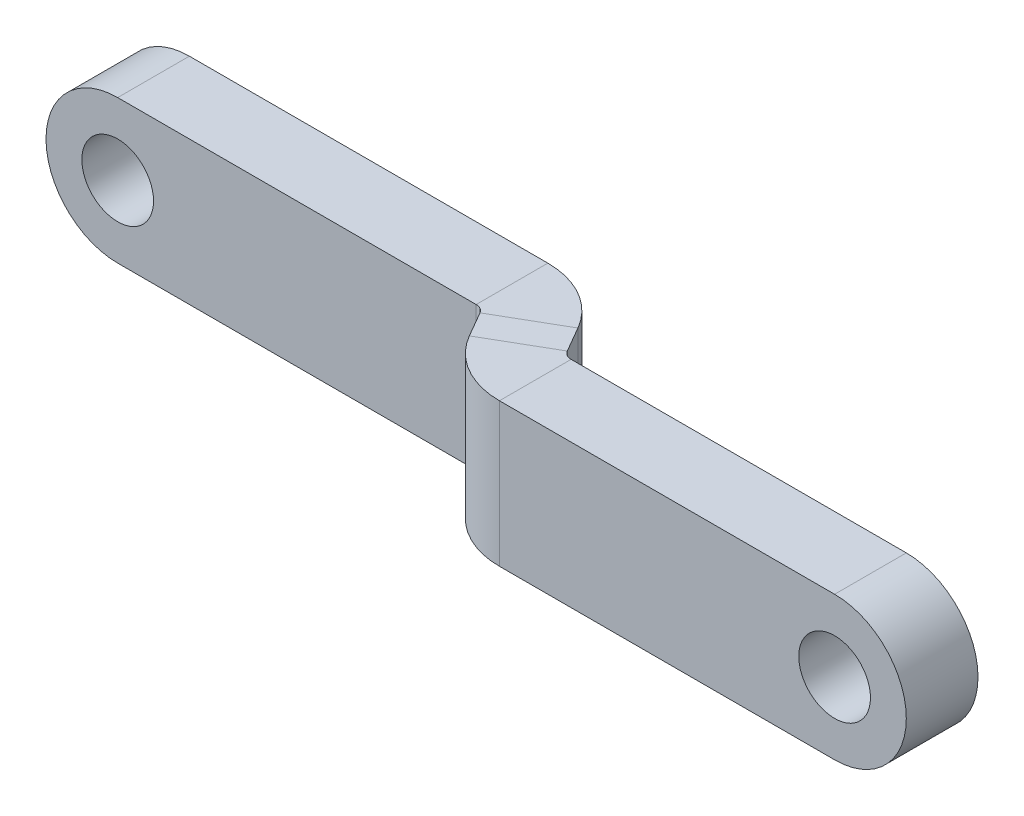
ISO-10303-21;
HEADER;
FILE_DESCRIPTION(('STEP AP214'),'2;1');
FILE_NAME('part.step','',(''),(''),'','','');
FILE_SCHEMA(('AUTOMOTIVE_DESIGN { 1 0 10303 214 1 1 1 1 }'));
ENDSEC;
DATA;
#1=APPLICATION_CONTEXT('core data for automotive mechanical design processes');
#2=APPLICATION_PROTOCOL_DEFINITION('international standard','automotive_design',2000,#1);
#3=PRODUCT_CONTEXT('',#1,'mechanical');
#4=PRODUCT('Part','Part','',(#3));
#5=PRODUCT_RELATED_PRODUCT_CATEGORY('part','',(#4));
#6=PRODUCT_DEFINITION_FORMATION('','',#4);
#7=PRODUCT_DEFINITION_CONTEXT('part definition',#1,'design');
#8=PRODUCT_DEFINITION('design','',#6,#7);
#9=PRODUCT_DEFINITION_SHAPE('','',#8);
#10=(LENGTH_UNIT() NAMED_UNIT(*) SI_UNIT(.MILLI.,.METRE.));
#11=(NAMED_UNIT(*) PLANE_ANGLE_UNIT() SI_UNIT($,.RADIAN.));
#12=(NAMED_UNIT(*) SI_UNIT($,.STERADIAN.) SOLID_ANGLE_UNIT());
#13=UNCERTAINTY_MEASURE_WITH_UNIT(LENGTH_MEASURE(1.E-05),#10,'distance_accuracy_value','');
#14=(GEOMETRIC_REPRESENTATION_CONTEXT(3) GLOBAL_UNCERTAINTY_ASSIGNED_CONTEXT((#13)) GLOBAL_UNIT_ASSIGNED_CONTEXT((#10,
#11,#12)) REPRESENTATION_CONTEXT('',''));
#15=CARTESIAN_POINT('',(0.,0.,0.));
#16=DIRECTION('',(0.,0.,1.));
#17=DIRECTION('',(1.,0.,0.));
#18=AXIS2_PLACEMENT_3D('',#15,#16,#17);
#19=CARTESIAN_POINT('',(15.7733615342484,5.,-26.7176066057512));
#20=DIRECTION('',(0.,1.,0.));
#21=DIRECTION('',(-0.86602540378444,0.,0.499999999999998));
#22=AXIS2_PLACEMENT_3D('',#19,#20,#21);
#23=PLANE('',#22);
#24=DIRECTION('',(-0.499999999999998,0.,-0.86602540378444));
#25=VECTOR('',#24,1.);
#26=CARTESIAN_POINT('',(11.4432345153262,5.,-24.2176066057512));
#27=LINE('',#26,#25);
#28=CARTESIAN_POINT('',(26.6560137771166,5.,2.13170000000001));
#29=VERTEX_POINT('',#28);
#30=CARTESIAN_POINT('',(25.6379143124276,5.,0.368300000000002));
#31=VERTEX_POINT('',#30);
#32=EDGE_CURVE('E250',#29,#31,#27,.T.);
#33=ORIENTED_EDGE('',*,*,#32,.F.);
#34=DIRECTION('',(0.86602540378444,0.,-0.499999999999998));
#35=VECTOR('',#34,1.);
#36=CARTESIAN_POINT('',(30.9861407960388,5.,-0.368299999999985));
#37=LINE('',#36,#35);
#38=CARTESIAN_POINT('',(30.9861407960388,5.,-0.368299999999983));
#39=VERTEX_POINT('',#38);
#40=EDGE_CURVE('E242',#29,#39,#37,.T.);
#41=ORIENTED_EDGE('',*,*,#40,.T.);
#42=DIRECTION('',(-0.499999999999998,0.,-0.86602540378444));
#43=VECTOR('',#42,1.);
#44=CARTESIAN_POINT('',(15.7733615342484,5.,-26.7176066057512));
#45=LINE('',#44,#43);
#46=CARTESIAN_POINT('',(29.9680413313498,5.,-2.13169999999999));
#47=VERTEX_POINT('',#46);
#48=EDGE_CURVE('E49',#39,#47,#45,.T.);
#49=ORIENTED_EDGE('',*,*,#48,.T.);
#50=DIRECTION('',(0.86602540378444,0.,-0.499999999999998));
#51=VECTOR('',#50,1.);
#52=CARTESIAN_POINT('',(29.9680413313498,5.,-2.13169999999999));
#53=LINE('',#52,#51);
#54=EDGE_CURVE('E238',#31,#47,#53,.T.);
#55=ORIENTED_EDGE('',*,*,#54,.F.);
#56=EDGE_LOOP('',(#33,#41,#49,#55));
#57=FACE_BOUND('',#56,.T.);
#58=ADVANCED_FACE('F45',(#57),#23,.T.);
#59=CARTESIAN_POINT('',(15.7733615342484,-5.,-26.7176066057512));
#60=DIRECTION('',(0.,-1.,0.));
#61=DIRECTION('',(0.86602540378444,0.,-0.499999999999998));
#62=AXIS2_PLACEMENT_3D('',#59,#60,#61);
#63=PLANE('',#62);
#64=DIRECTION('',(0.499999999999998,0.,0.86602540378444));
#65=VECTOR('',#64,1.);
#66=CARTESIAN_POINT('',(15.7733615342484,-5.,-26.7176066057512));
#67=LINE('',#66,#65);
#68=CARTESIAN_POINT('',(29.9680413313498,-5.,-2.13169999999999));
#69=VERTEX_POINT('',#68);
#70=CARTESIAN_POINT('',(30.9861407960388,-5.,-0.368299999999984));
#71=VERTEX_POINT('',#70);
#72=EDGE_CURVE('E247',#69,#71,#67,.T.);
#73=ORIENTED_EDGE('',*,*,#72,.T.);
#74=DIRECTION('',(-0.86602540378444,0.,0.499999999999998));
#75=VECTOR('',#74,1.);
#76=CARTESIAN_POINT('',(30.9861407960388,-5.,-0.368299999999985));
#77=LINE('',#76,#75);
#78=CARTESIAN_POINT('',(26.6560137771166,-5.,2.13170000000001));
#79=VERTEX_POINT('',#78);
#80=EDGE_CURVE('E12',#71,#79,#77,.T.);
#81=ORIENTED_EDGE('',*,*,#80,.T.);
#82=DIRECTION('',(0.499999999999998,0.,0.86602540378444));
#83=VECTOR('',#82,1.);
#84=CARTESIAN_POINT('',(11.4432345153262,-5.,-24.2176066057512));
#85=LINE('',#84,#83);
#86=CARTESIAN_POINT('',(25.6379143124276,-5.,0.368300000000002));
#87=VERTEX_POINT('',#86);
#88=EDGE_CURVE('E196',#87,#79,#85,.T.);
#89=ORIENTED_EDGE('',*,*,#88,.F.);
#90=DIRECTION('',(-0.86602540378444,0.,0.499999999999998));
#91=VECTOR('',#90,1.);
#92=CARTESIAN_POINT('',(29.9680413313498,-5.,-2.13169999999999));
#93=LINE('',#92,#91);
#94=EDGE_CURVE('E234',#69,#87,#93,.T.);
#95=ORIENTED_EDGE('',*,*,#94,.F.);
#96=EDGE_LOOP('',(#73,#81,#89,#95));
#97=FACE_BOUND('',#96,.T.);
#98=ADVANCED_FACE('F47',(#97),#63,.T.);
#99=CARTESIAN_POINT('',(11.4432345153262,0.,-24.2176066057512));
#100=DIRECTION('',(-0.86602540378444,0.,0.499999999999998));
#101=DIRECTION('',(0.499999999999998,0.,0.86602540378444));
#102=AXIS2_PLACEMENT_3D('',#99,#100,#101);
#103=PLANE('',#102);
#104=ORIENTED_EDGE('',*,*,#88,.T.);
#105=DIRECTION('',(0.,1.,0.));
#106=VECTOR('',#105,1.);
#107=CARTESIAN_POINT('',(26.6560137771166,0.,2.13170000000001));
#108=LINE('',#107,#106);
#109=EDGE_CURVE('E54',#79,#29,#108,.T.);
#110=ORIENTED_EDGE('',*,*,#109,.T.);
#111=ORIENTED_EDGE('',*,*,#32,.T.);
#112=DIRECTION('',(0.,1.,0.));
#113=VECTOR('',#112,1.);
#114=CARTESIAN_POINT('',(25.6379143124276,0.,0.368300000000002));
#115=LINE('',#114,#113);
#116=EDGE_CURVE('E236',#87,#31,#115,.T.);
#117=ORIENTED_EDGE('',*,*,#116,.F.);
#118=EDGE_LOOP('',(#104,#110,#111,#117));
#119=FACE_BOUND('',#118,.T.);
#120=ADVANCED_FACE('F256',(#119),#103,.T.);
#121=CARTESIAN_POINT('',(15.7733615342484,0.,-26.7176066057512));
#122=DIRECTION('',(-0.86602540378444,0.,0.499999999999998));
#123=DIRECTION('',(0.499999999999998,0.,0.86602540378444));
#124=AXIS2_PLACEMENT_3D('',#121,#122,#123);
#125=PLANE('',#124);
#126=DIRECTION('',(0.,1.,0.));
#127=VECTOR('',#126,1.);
#128=CARTESIAN_POINT('',(30.9861407960388,0.,-0.368299999999985));
#129=LINE('',#128,#127);
#130=EDGE_CURVE('E240',#71,#39,#129,.T.);
#131=ORIENTED_EDGE('',*,*,#130,.F.);
#132=ORIENTED_EDGE('',*,*,#72,.F.);
#133=DIRECTION('',(0.,1.,0.));
#134=VECTOR('',#133,1.);
#135=CARTESIAN_POINT('',(29.9680413313498,0.,-2.13169999999999));
#136=LINE('',#135,#134);
#137=EDGE_CURVE('E231',#69,#47,#136,.T.);
#138=ORIENTED_EDGE('',*,*,#137,.T.);
#139=ORIENTED_EDGE('',*,*,#48,.F.);
#140=EDGE_LOOP('',(#131,#132,#138,#139));
#141=FACE_BOUND('',#140,.T.);
#142=ADVANCED_FACE('F269',(#141),#125,.F.);
#143=CARTESIAN_POINT('',(0.,0.,-5.));
#144=DIRECTION('',(0.,0.,1.));
#145=DIRECTION('',(1.,0.,0.));
#146=AXIS2_PLACEMENT_3D('',#143,#144,#145);
#147=CYLINDRICAL_SURFACE('',#146,2.5);
#148=CARTESIAN_POINT('',(0.,0.,-5.));
#149=DIRECTION('',(0.,0.,1.));
#150=DIRECTION('',(1.,0.,0.));
#151=AXIS2_PLACEMENT_3D('',#148,#149,#150);
#152=CIRCLE('',#151,2.5);
#153=CARTESIAN_POINT('',(2.5,0.,-5.));
#154=VERTEX_POINT('',#153);
#155=EDGE_CURVE('E219',#154,#154,#152,.T.);
#156=ORIENTED_EDGE('',*,*,#155,.F.);
#157=EDGE_LOOP('',(#156));
#158=FACE_BOUND('',#157,.T.);
#159=CARTESIAN_POINT('',(0.,0.,0.));
#160=DIRECTION('',(0.,0.,1.));
#161=DIRECTION('',(1.,0.,0.));
#162=AXIS2_PLACEMENT_3D('',#159,#160,#161);
#163=CIRCLE('',#162,2.5);
#164=CARTESIAN_POINT('',(2.5,0.,0.));
#165=VERTEX_POINT('',#164);
#166=EDGE_CURVE('E227',#165,#165,#163,.T.);
#167=ORIENTED_EDGE('',*,*,#166,.T.);
#168=EDGE_LOOP('',(#167));
#169=FACE_BOUND('',#168,.T.);
#170=ADVANCED_FACE('F318',(#158,#169),#147,.F.);
#171=CARTESIAN_POINT('',(0.,0.,-5.));
#172=DIRECTION('',(0.,0.,1.));
#173=DIRECTION('',(1.,0.,0.));
#174=AXIS2_PLACEMENT_3D('',#171,#172,#173);
#175=CYLINDRICAL_SURFACE('',#174,5.);
#176=CARTESIAN_POINT('',(0.,0.,0.));
#177=DIRECTION('',(0.,0.,1.));
#178=DIRECTION('',(1.,0.,0.));
#179=AXIS2_PLACEMENT_3D('',#176,#177,#178);
#180=CIRCLE('',#179,5.);
#181=CARTESIAN_POINT('',(0.,5.,0.));
#182=VERTEX_POINT('',#181);
#183=CARTESIAN_POINT('',(0.,-5.,0.));
#184=VERTEX_POINT('',#183);
#185=EDGE_CURVE('E202',#182,#184,#180,.T.);
#186=ORIENTED_EDGE('',*,*,#185,.F.);
#187=DIRECTION('',(0.,0.,1.));
#188=VECTOR('',#187,1.);
#189=CARTESIAN_POINT('',(0.,5.,-5.));
#190=LINE('',#189,#188);
#191=CARTESIAN_POINT('',(0.,5.,-5.));
#192=VERTEX_POINT('',#191);
#193=EDGE_CURVE('E193',#192,#182,#190,.T.);
#194=ORIENTED_EDGE('',*,*,#193,.F.);
#195=CARTESIAN_POINT('',(0.,0.,-5.));
#196=DIRECTION('',(0.,0.,1.));
#197=DIRECTION('',(1.,0.,0.));
#198=AXIS2_PLACEMENT_3D('',#195,#196,#197);
#199=CIRCLE('',#198,5.);
#200=CARTESIAN_POINT('',(0.,-5.,-5.));
#201=VERTEX_POINT('',#200);
#202=EDGE_CURVE('E224',#192,#201,#199,.T.);
#203=ORIENTED_EDGE('',*,*,#202,.T.);
#204=DIRECTION('',(0.,0.,1.));
#205=VECTOR('',#204,1.);
#206=CARTESIAN_POINT('',(0.,-5.,-5.));
#207=LINE('',#206,#205);
#208=EDGE_CURVE('E222',#201,#184,#207,.T.);
#209=ORIENTED_EDGE('',*,*,#208,.T.);
#210=EDGE_LOOP('',(#186,#194,#203,#209));
#211=FACE_BOUND('',#210,.T.);
#212=ADVANCED_FACE('F322',(#211),#175,.T.);
#213=CARTESIAN_POINT('',(0.,0.,-5.));
#214=DIRECTION('',(0.,0.,1.));
#215=DIRECTION('',(1.,0.,0.));
#216=AXIS2_PLACEMENT_3D('',#213,#214,#215);
#217=PLANE('',#216);
#218=DIRECTION('',(0.,1.,0.));
#219=VECTOR('',#218,1.);
#220=CARTESIAN_POINT('',(25.,0.,-5.));
#221=LINE('',#220,#219);
#222=CARTESIAN_POINT('',(25.,-5.,-5.));
#223=VERTEX_POINT('',#222);
#224=CARTESIAN_POINT('',(25.,5.,-5.));
#225=VERTEX_POINT('',#224);
#226=EDGE_CURVE('E189',#223,#225,#221,.T.);
#227=ORIENTED_EDGE('',*,*,#226,.F.);
#228=DIRECTION('',(1.,0.,0.));
#229=VECTOR('',#228,1.);
#230=CARTESIAN_POINT('',(0.,-5.,-5.));
#231=LINE('',#230,#229);
#232=EDGE_CURVE('E216',#201,#223,#231,.T.);
#233=ORIENTED_EDGE('',*,*,#232,.F.);
#234=ORIENTED_EDGE('',*,*,#202,.F.);
#235=DIRECTION('',(-1.,0.,0.));
#236=VECTOR('',#235,1.);
#237=CARTESIAN_POINT('',(0.,5.,-5.));
#238=LINE('',#237,#236);
#239=EDGE_CURVE('E197',#225,#192,#238,.T.);
#240=ORIENTED_EDGE('',*,*,#239,.F.);
#241=EDGE_LOOP('',(#227,#233,#234,#240));
#242=FACE_BOUND('',#241,.T.);
#243=ORIENTED_EDGE('',*,*,#155,.T.);
#244=EDGE_LOOP('',(#243));
#245=FACE_BOUND('',#244,.T.);
#246=ADVANCED_FACE('F328',(#242,#245),#217,.F.);
#247=CARTESIAN_POINT('',(0.,-5.,-5.));
#248=DIRECTION('',(0.,-1.,0.));
#249=DIRECTION('',(0.,0.,-1.));
#250=AXIS2_PLACEMENT_3D('',#247,#248,#249);
#251=PLANE('',#250);
#252=ORIENTED_EDGE('',*,*,#232,.T.);
#253=DIRECTION('',(0.,0.,1.));
#254=VECTOR('',#253,1.);
#255=CARTESIAN_POINT('',(25.,-5.,-5.));
#256=LINE('',#255,#254);
#257=CARTESIAN_POINT('',(25.,-5.,0.));
#258=VERTEX_POINT('',#257);
#259=EDGE_CURVE('E213',#223,#258,#256,.T.);
#260=ORIENTED_EDGE('',*,*,#259,.T.);
#261=DIRECTION('',(1.,0.,0.));
#262=VECTOR('',#261,1.);
#263=CARTESIAN_POINT('',(0.,-5.,0.));
#264=LINE('',#263,#262);
#265=EDGE_CURVE('E210',#184,#258,#264,.T.);
#266=ORIENTED_EDGE('',*,*,#265,.F.);
#267=ORIENTED_EDGE('',*,*,#208,.F.);
#268=EDGE_LOOP('',(#252,#260,#266,#267));
#269=FACE_BOUND('',#268,.T.);
#270=ADVANCED_FACE('F339',(#269),#251,.T.);
#271=CARTESIAN_POINT('',(0.,0.,0.));
#272=DIRECTION('',(0.,0.,1.));
#273=DIRECTION('',(1.,0.,0.));
#274=AXIS2_PLACEMENT_3D('',#271,#272,#273);
#275=PLANE('',#274);
#276=ORIENTED_EDGE('',*,*,#166,.F.);
#277=EDGE_LOOP('',(#276));
#278=FACE_BOUND('',#277,.T.);
#279=ORIENTED_EDGE('',*,*,#265,.T.);
#280=DIRECTION('',(0.,1.,0.));
#281=VECTOR('',#280,1.);
#282=CARTESIAN_POINT('',(25.,0.,0.));
#283=LINE('',#282,#281);
#284=CARTESIAN_POINT('',(25.,5.,0.));
#285=VERTEX_POINT('',#284);
#286=EDGE_CURVE('E207',#258,#285,#283,.T.);
#287=ORIENTED_EDGE('',*,*,#286,.T.);
#288=DIRECTION('',(-1.,0.,0.));
#289=VECTOR('',#288,1.);
#290=CARTESIAN_POINT('',(0.,5.,0.));
#291=LINE('',#290,#289);
#292=EDGE_CURVE('E205',#285,#182,#291,.T.);
#293=ORIENTED_EDGE('',*,*,#292,.T.);
#294=ORIENTED_EDGE('',*,*,#185,.T.);
#295=EDGE_LOOP('',(#279,#287,#293,#294));
#296=FACE_BOUND('',#295,.T.);
#297=ADVANCED_FACE('F343',(#278,#296),#275,.T.);
#298=CARTESIAN_POINT('',(0.,5.,-5.));
#299=DIRECTION('',(0.,1.,0.));
#300=DIRECTION('',(0.,0.,1.));
#301=AXIS2_PLACEMENT_3D('',#298,#299,#300);
#302=PLANE('',#301);
#303=ORIENTED_EDGE('',*,*,#292,.F.);
#304=DIRECTION('',(0.,0.,-1.));
#305=VECTOR('',#304,1.);
#306=CARTESIAN_POINT('',(25.,5.,-5.));
#307=LINE('',#306,#305);
#308=EDGE_CURVE('E199',#285,#225,#307,.T.);
#309=ORIENTED_EDGE('',*,*,#308,.T.);
#310=ORIENTED_EDGE('',*,*,#239,.T.);
#311=ORIENTED_EDGE('',*,*,#193,.T.);
#312=EDGE_LOOP('',(#303,#309,#310,#311));
#313=FACE_BOUND('',#312,.T.);
#314=ADVANCED_FACE('F346',(#313),#302,.T.);
#315=CARTESIAN_POINT('',(25.,-5.,0.7366));
#316=DIRECTION('',(0.,-1.,0.));
#317=DIRECTION('',(0.,0.,-1.));
#318=AXIS2_PLACEMENT_3D('',#315,#316,#317);
#319=PLANE('',#318);
#320=ORIENTED_EDGE('',*,*,#94,.T.);
#321=CARTESIAN_POINT('',(25.,-5.,0.7366));
#322=DIRECTION('',(0.,-1.,0.));
#323=DIRECTION('',(0.,0.,-1.));
#324=AXIS2_PLACEMENT_3D('',#321,#322,#323);
#325=CIRCLE('',#324,0.7366);
#326=EDGE_CURVE('E180',#87,#258,#325,.F.);
#327=ORIENTED_EDGE('',*,*,#326,.T.);
#328=ORIENTED_EDGE('',*,*,#259,.F.);
#329=CARTESIAN_POINT('',(25.,-5.,0.7366));
#330=DIRECTION('',(0.,1.,0.));
#331=DIRECTION('',(0.,0.,-1.));
#332=AXIS2_PLACEMENT_3D('',#329,#330,#331);
#333=CIRCLE('',#332,5.7366);
#334=EDGE_CURVE('E184',#69,#223,#333,.T.);
#335=ORIENTED_EDGE('',*,*,#334,.F.);
#336=EDGE_LOOP('',(#320,#327,#328,#335));
#337=FACE_BOUND('',#336,.T.);
#338=ADVANCED_FACE('F349',(#337),#319,.T.);
#339=CARTESIAN_POINT('',(25.,5.,0.7366));
#340=DIRECTION('',(0.,1.,0.));
#341=DIRECTION('',(0.,0.,1.));
#342=AXIS2_PLACEMENT_3D('',#339,#340,#341);
#343=PLANE('',#342);
#344=CARTESIAN_POINT('',(25.,5.,0.7366));
#345=DIRECTION('',(0.,-1.,0.));
#346=DIRECTION('',(0.,0.,-1.));
#347=AXIS2_PLACEMENT_3D('',#344,#345,#346);
#348=CIRCLE('',#347,0.7366);
#349=EDGE_CURVE('E187',#285,#31,#348,.T.);
#350=ORIENTED_EDGE('',*,*,#349,.T.);
#351=ORIENTED_EDGE('',*,*,#54,.T.);
#352=CARTESIAN_POINT('',(25.,5.,0.7366));
#353=DIRECTION('',(0.,-1.,0.));
#354=DIRECTION('',(0.,0.,1.));
#355=AXIS2_PLACEMENT_3D('',#352,#353,#354);
#356=CIRCLE('',#355,5.7366);
#357=EDGE_CURVE('E70',#225,#47,#356,.T.);
#358=ORIENTED_EDGE('',*,*,#357,.F.);
#359=ORIENTED_EDGE('',*,*,#308,.F.);
#360=EDGE_LOOP('',(#350,#351,#358,#359));
#361=FACE_BOUND('',#360,.T.);
#362=ADVANCED_FACE('F334',(#361),#343,.T.);
#363=CARTESIAN_POINT('',(25.,11.6827975442021,0.7366));
#364=DIRECTION('',(0.,-1.,0.));
#365=DIRECTION('',(0.,0.,-1.));
#366=AXIS2_PLACEMENT_3D('',#363,#364,#365);
#367=CYLINDRICAL_SURFACE('',#366,5.7366);
#368=ORIENTED_EDGE('',*,*,#226,.T.);
#369=ORIENTED_EDGE('',*,*,#357,.T.);
#370=ORIENTED_EDGE('',*,*,#137,.F.);
#371=ORIENTED_EDGE('',*,*,#334,.T.);
#372=EDGE_LOOP('',(#368,#369,#370,#371));
#373=FACE_BOUND('',#372,.T.);
#374=ADVANCED_FACE('F372',(#373),#367,.T.);
#375=CARTESIAN_POINT('',(25.,11.6827975442021,0.7366));
#376=DIRECTION('',(0.,-1.,0.));
#377=DIRECTION('',(0.,0.,-1.));
#378=AXIS2_PLACEMENT_3D('',#375,#376,#377);
#379=CYLINDRICAL_SURFACE('',#378,0.7366);
#380=ORIENTED_EDGE('',*,*,#286,.F.);
#381=ORIENTED_EDGE('',*,*,#326,.F.);
#382=ORIENTED_EDGE('',*,*,#116,.T.);
#383=ORIENTED_EDGE('',*,*,#349,.F.);
#384=EDGE_LOOP('',(#380,#381,#382,#383));
#385=FACE_BOUND('',#384,.T.);
#386=ADVANCED_FACE('F364',(#385),#379,.F.);
#387=CARTESIAN_POINT('',(31.6240551084664,-5.,-0.736599999999983));
#388=DIRECTION('',(0.,1.,0.));
#389=DIRECTION('',(0.,0.,1.));
#390=AXIS2_PLACEMENT_3D('',#387,#388,#389);
#391=PLANE('',#390);
#392=DIRECTION('',(0.,0.,1.));
#393=VECTOR('',#392,1.);
#394=CARTESIAN_POINT('',(31.6240551084664,-5.,0.));
#395=LINE('',#394,#393);
#396=CARTESIAN_POINT('',(31.6240551084664,-5.,0.));
#397=VERTEX_POINT('',#396);
#398=CARTESIAN_POINT('',(31.6240551084664,-5.,5.00000000000003));
#399=VERTEX_POINT('',#398);
#400=EDGE_CURVE('E142',#397,#399,#395,.T.);
#401=ORIENTED_EDGE('',*,*,#400,.T.);
#402=CARTESIAN_POINT('',(31.6240551084664,-5.,-0.736599999999983));
#403=DIRECTION('',(0.,-1.,0.));
#404=DIRECTION('',(0.,0.,-1.));
#405=AXIS2_PLACEMENT_3D('',#402,#403,#404);
#406=CIRCLE('',#405,5.7366);
#407=EDGE_CURVE('E62',#399,#79,#406,.T.);
#408=ORIENTED_EDGE('',*,*,#407,.T.);
#409=ORIENTED_EDGE('',*,*,#80,.F.);
#410=CARTESIAN_POINT('',(31.6240551084664,-5.,-0.736599999999983));
#411=DIRECTION('',(0.,-1.,0.));
#412=DIRECTION('',(0.,0.,1.));
#413=AXIS2_PLACEMENT_3D('',#410,#411,#412);
#414=CIRCLE('',#413,0.7366);
#415=EDGE_CURVE('E173',#397,#71,#414,.T.);
#416=ORIENTED_EDGE('',*,*,#415,.F.);
#417=EDGE_LOOP('',(#401,#408,#409,#416));
#418=FACE_BOUND('',#417,.T.);
#419=ADVANCED_FACE('F261',(#418),#391,.F.);
#420=CARTESIAN_POINT('',(31.6240551084664,5.,-0.736599999999983));
#421=DIRECTION('',(0.,-1.,0.));
#422=DIRECTION('',(0.,0.,-1.));
#423=AXIS2_PLACEMENT_3D('',#420,#421,#422);
#424=PLANE('',#423);
#425=CARTESIAN_POINT('',(31.6240551084664,5.,-0.736599999999983));
#426=DIRECTION('',(0.,-1.,0.));
#427=DIRECTION('',(0.,0.,-1.));
#428=AXIS2_PLACEMENT_3D('',#425,#426,#427);
#429=CIRCLE('',#428,5.7366);
#430=CARTESIAN_POINT('',(31.6240551084664,5.,5.00000000000003));
#431=VERTEX_POINT('',#430);
#432=EDGE_CURVE('E177',#29,#431,#429,.F.);
#433=ORIENTED_EDGE('',*,*,#432,.T.);
#434=DIRECTION('',(0.,0.,-1.));
#435=VECTOR('',#434,1.);
#436=CARTESIAN_POINT('',(31.6240551084664,5.,0.));
#437=LINE('',#436,#435);
#438=CARTESIAN_POINT('',(31.6240551084664,5.,0.));
#439=VERTEX_POINT('',#438);
#440=EDGE_CURVE('E161',#431,#439,#437,.T.);
#441=ORIENTED_EDGE('',*,*,#440,.T.);
#442=CARTESIAN_POINT('',(31.6240551084664,5.,-0.736599999999983));
#443=DIRECTION('',(0.,1.,0.));
#444=DIRECTION('',(0.,0.,-1.));
#445=AXIS2_PLACEMENT_3D('',#442,#443,#444);
#446=CIRCLE('',#445,0.7366);
#447=EDGE_CURVE('E176',#39,#439,#446,.T.);
#448=ORIENTED_EDGE('',*,*,#447,.F.);
#449=ORIENTED_EDGE('',*,*,#40,.F.);
#450=EDGE_LOOP('',(#433,#441,#448,#449));
#451=FACE_BOUND('',#450,.T.);
#452=ADVANCED_FACE('F276',(#451),#424,.F.);
#453=CARTESIAN_POINT('',(31.6240551084664,12.8779064125431,-0.736599999999983));
#454=DIRECTION('',(0.,-1.,0.));
#455=DIRECTION('',(0.,0.,-1.));
#456=AXIS2_PLACEMENT_3D('',#453,#454,#455);
#457=CYLINDRICAL_SURFACE('',#456,0.7366);
#458=ORIENTED_EDGE('',*,*,#130,.T.);
#459=ORIENTED_EDGE('',*,*,#447,.T.);
#460=DIRECTION('',(0.,1.,0.));
#461=VECTOR('',#460,1.);
#462=CARTESIAN_POINT('',(31.6240551084664,0.,0.));
#463=LINE('',#462,#461);
#464=EDGE_CURVE('E266',#397,#439,#463,.T.);
#465=ORIENTED_EDGE('',*,*,#464,.F.);
#466=ORIENTED_EDGE('',*,*,#415,.T.);
#467=EDGE_LOOP('',(#458,#459,#465,#466));
#468=FACE_BOUND('',#467,.T.);
#469=ADVANCED_FACE('F264',(#468),#457,.F.);
#470=CARTESIAN_POINT('',(31.6240551084664,12.8779064125431,-0.736599999999983));
#471=DIRECTION('',(0.,-1.,0.));
#472=DIRECTION('',(0.,0.,-1.));
#473=AXIS2_PLACEMENT_3D('',#470,#471,#472);
#474=CYLINDRICAL_SURFACE('',#473,5.7366);
#475=ORIENTED_EDGE('',*,*,#109,.F.);
#476=ORIENTED_EDGE('',*,*,#407,.F.);
#477=DIRECTION('',(0.,1.,0.));
#478=VECTOR('',#477,1.);
#479=CARTESIAN_POINT('',(31.6240551084664,0.,5.00000000000003));
#480=LINE('',#479,#478);
#481=EDGE_CURVE('E166',#399,#431,#480,.T.);
#482=ORIENTED_EDGE('',*,*,#481,.T.);
#483=ORIENTED_EDGE('',*,*,#432,.F.);
#484=EDGE_LOOP('',(#475,#476,#482,#483));
#485=FACE_BOUND('',#484,.T.);
#486=ADVANCED_FACE('F278',(#485),#474,.T.);
#487=CARTESIAN_POINT('',(55.,0.,0.));
#488=DIRECTION('',(0.,0.,1.));
#489=DIRECTION('',(1.,0.,0.));
#490=AXIS2_PLACEMENT_3D('',#487,#488,#489);
#491=CYLINDRICAL_SURFACE('',#490,5.);
#492=CARTESIAN_POINT('',(55.,0.,5.00000000000003));
#493=DIRECTION('',(0.,0.,1.));
#494=DIRECTION('',(1.,0.,0.));
#495=AXIS2_PLACEMENT_3D('',#492,#493,#494);
#496=CIRCLE('',#495,5.);
#497=CARTESIAN_POINT('',(55.,-5.,5.00000000000003));
#498=VERTEX_POINT('',#497);
#499=CARTESIAN_POINT('',(55.,5.,5.00000000000003));
#500=VERTEX_POINT('',#499);
#501=EDGE_CURVE('E154',#498,#500,#496,.T.);
#502=ORIENTED_EDGE('',*,*,#501,.F.);
#503=DIRECTION('',(0.,0.,1.));
#504=VECTOR('',#503,1.);
#505=CARTESIAN_POINT('',(55.,-5.,0.));
#506=LINE('',#505,#504);
#507=CARTESIAN_POINT('',(55.,-5.,0.));
#508=VERTEX_POINT('',#507);
#509=EDGE_CURVE('E140',#508,#498,#506,.T.);
#510=ORIENTED_EDGE('',*,*,#509,.F.);
#511=CARTESIAN_POINT('',(55.,0.,0.));
#512=DIRECTION('',(0.,0.,1.));
#513=DIRECTION('',(1.,0.,0.));
#514=AXIS2_PLACEMENT_3D('',#511,#512,#513);
#515=CIRCLE('',#514,5.);
#516=CARTESIAN_POINT('',(55.,5.,0.));
#517=VERTEX_POINT('',#516);
#518=EDGE_CURVE('E152',#508,#517,#515,.T.);
#519=ORIENTED_EDGE('',*,*,#518,.T.);
#520=DIRECTION('',(0.,0.,1.));
#521=VECTOR('',#520,1.);
#522=CARTESIAN_POINT('',(55.,5.,0.));
#523=LINE('',#522,#521);
#524=EDGE_CURVE('E160',#517,#500,#523,.T.);
#525=ORIENTED_EDGE('',*,*,#524,.T.);
#526=EDGE_LOOP('',(#502,#510,#519,#525));
#527=FACE_BOUND('',#526,.T.);
#528=ADVANCED_FACE('F150',(#527),#491,.T.);
#529=CARTESIAN_POINT('',(55.,0.,0.));
#530=DIRECTION('',(0.,0.,1.));
#531=DIRECTION('',(1.,0.,0.));
#532=AXIS2_PLACEMENT_3D('',#529,#530,#531);
#533=CYLINDRICAL_SURFACE('',#532,2.5);
#534=CARTESIAN_POINT('',(55.,0.,0.));
#535=DIRECTION('',(0.,0.,1.));
#536=DIRECTION('',(1.,0.,0.));
#537=AXIS2_PLACEMENT_3D('',#534,#535,#536);
#538=CIRCLE('',#537,2.5);
#539=CARTESIAN_POINT('',(57.5,0.,0.));
#540=VERTEX_POINT('',#539);
#541=EDGE_CURVE('E290',#540,#540,#538,.T.);
#542=ORIENTED_EDGE('',*,*,#541,.F.);
#543=EDGE_LOOP('',(#542));
#544=FACE_BOUND('',#543,.T.);
#545=CARTESIAN_POINT('',(55.,0.,5.00000000000003));
#546=DIRECTION('',(0.,0.,1.));
#547=DIRECTION('',(1.,0.,0.));
#548=AXIS2_PLACEMENT_3D('',#545,#546,#547);
#549=CIRCLE('',#548,2.5);
#550=CARTESIAN_POINT('',(57.5,0.,5.00000000000003));
#551=VERTEX_POINT('',#550);
#552=EDGE_CURVE('E163',#551,#551,#549,.T.);
#553=ORIENTED_EDGE('',*,*,#552,.T.);
#554=EDGE_LOOP('',(#553));
#555=FACE_BOUND('',#554,.T.);
#556=ADVANCED_FACE('F298',(#544,#555),#533,.F.);
#557=CARTESIAN_POINT('',(-2.1908630093174,0.,0.));
#558=DIRECTION('',(0.,0.,1.));
#559=DIRECTION('',(1.,0.,0.));
#560=AXIS2_PLACEMENT_3D('',#557,#558,#559);
#561=PLANE('',#560);
#562=ORIENTED_EDGE('',*,*,#541,.T.);
#563=EDGE_LOOP('',(#562));
#564=FACE_BOUND('',#563,.T.);
#565=DIRECTION('',(1.,0.,0.));
#566=VECTOR('',#565,1.);
#567=CARTESIAN_POINT('',(-2.1908630093174,-5.,0.));
#568=LINE('',#567,#566);
#569=EDGE_CURVE('E137',#397,#508,#568,.T.);
#570=ORIENTED_EDGE('',*,*,#569,.F.);
#571=ORIENTED_EDGE('',*,*,#464,.T.);
#572=DIRECTION('',(-1.,0.,0.));
#573=VECTOR('',#572,1.);
#574=CARTESIAN_POINT('',(-2.1908630093174,5.,0.));
#575=LINE('',#574,#573);
#576=EDGE_CURVE('E158',#517,#439,#575,.T.);
#577=ORIENTED_EDGE('',*,*,#576,.F.);
#578=ORIENTED_EDGE('',*,*,#518,.F.);
#579=EDGE_LOOP('',(#570,#571,#577,#578));
#580=FACE_BOUND('',#579,.T.);
#581=ADVANCED_FACE('F156',(#564,#580),#561,.F.);
#582=CARTESIAN_POINT('',(-2.1908630093174,5.,0.));
#583=DIRECTION('',(0.,1.,0.));
#584=DIRECTION('',(0.,0.,1.));
#585=AXIS2_PLACEMENT_3D('',#582,#583,#584);
#586=PLANE('',#585);
#587=ORIENTED_EDGE('',*,*,#440,.F.);
#588=DIRECTION('',(-1.,0.,0.));
#589=VECTOR('',#588,1.);
#590=CARTESIAN_POINT('',(-2.1908630093174,5.,5.00000000000003));
#591=LINE('',#590,#589);
#592=EDGE_CURVE('E146',#500,#431,#591,.T.);
#593=ORIENTED_EDGE('',*,*,#592,.F.);
#594=ORIENTED_EDGE('',*,*,#524,.F.);
#595=ORIENTED_EDGE('',*,*,#576,.T.);
#596=EDGE_LOOP('',(#587,#593,#594,#595));
#597=FACE_BOUND('',#596,.T.);
#598=ADVANCED_FACE('F287',(#597),#586,.T.);
#599=CARTESIAN_POINT('',(-2.1908630093174,0.,5.00000000000003));
#600=DIRECTION('',(0.,0.,1.));
#601=DIRECTION('',(1.,0.,0.));
#602=AXIS2_PLACEMENT_3D('',#599,#600,#601);
#603=PLANE('',#602);
#604=ORIENTED_EDGE('',*,*,#481,.F.);
#605=DIRECTION('',(1.,0.,0.));
#606=VECTOR('',#605,1.);
#607=CARTESIAN_POINT('',(-2.1908630093174,-5.,5.00000000000003));
#608=LINE('',#607,#606);
#609=EDGE_CURVE('E283',#399,#498,#608,.T.);
#610=ORIENTED_EDGE('',*,*,#609,.T.);
#611=ORIENTED_EDGE('',*,*,#501,.T.);
#612=ORIENTED_EDGE('',*,*,#592,.T.);
#613=EDGE_LOOP('',(#604,#610,#611,#612));
#614=FACE_BOUND('',#613,.T.);
#615=ORIENTED_EDGE('',*,*,#552,.F.);
#616=EDGE_LOOP('',(#615));
#617=FACE_BOUND('',#616,.T.);
#618=ADVANCED_FACE('F281',(#614,#617),#603,.T.);
#619=CARTESIAN_POINT('',(-2.1908630093174,-5.,0.));
#620=DIRECTION('',(0.,-1.,0.));
#621=DIRECTION('',(0.,0.,-1.));
#622=AXIS2_PLACEMENT_3D('',#619,#620,#621);
#623=PLANE('',#622);
#624=ORIENTED_EDGE('',*,*,#400,.F.);
#625=ORIENTED_EDGE('',*,*,#569,.T.);
#626=ORIENTED_EDGE('',*,*,#509,.T.);
#627=ORIENTED_EDGE('',*,*,#609,.F.);
#628=EDGE_LOOP('',(#624,#625,#626,#627));
#629=FACE_BOUND('',#628,.T.);
#630=ADVANCED_FACE('F139',(#629),#623,.T.);
#631=CLOSED_SHELL('',(#58,#98,#120,#142,#170,#212,#246,#270,#297,#314,#338,#362,#374,#386,#419,
#452,#469,#486,#528,#556,#581,#598,#618,#630));
#632=MANIFOLD_SOLID_BREP('B2',#631);
#633=ADVANCED_BREP_SHAPE_REPRESENTATION('',(#18,#632),#14);
#634=SHAPE_DEFINITION_REPRESENTATION(#9,#633);
ENDSEC;
END-ISO-10303-21;
